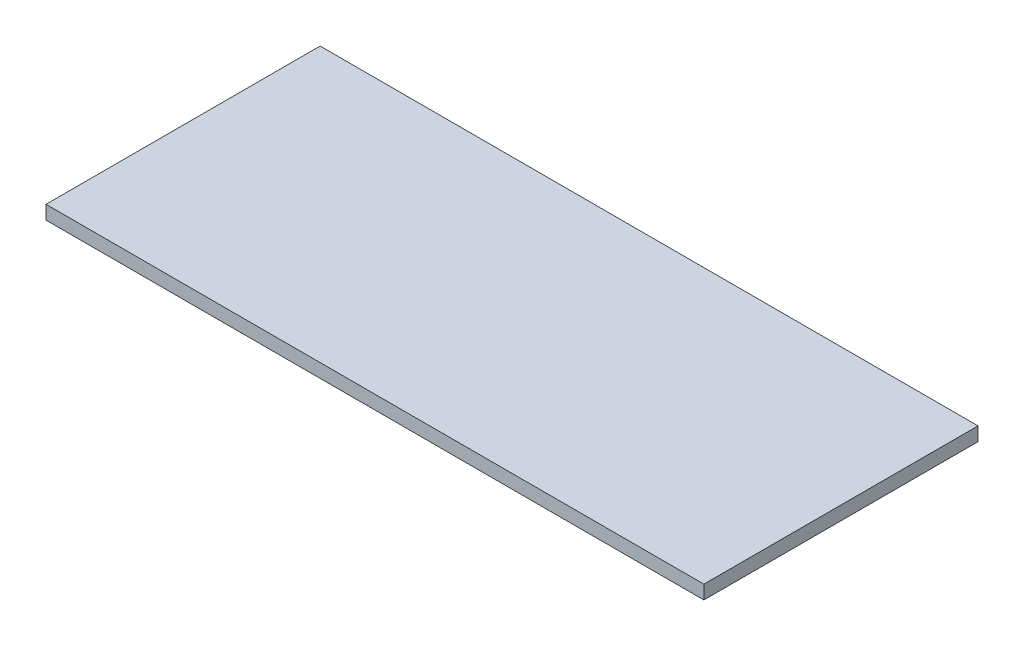
ISO-10303-21;
HEADER;
FILE_DESCRIPTION(('STEP AP214'),'2;1');
FILE_NAME('part.step','',(''),(''),'','','');
FILE_SCHEMA(('AUTOMOTIVE_DESIGN { 1 0 10303 214 1 1 1 1 }'));
ENDSEC;
DATA;
#1=APPLICATION_CONTEXT('core data for automotive mechanical design processes');
#2=APPLICATION_PROTOCOL_DEFINITION('international standard','automotive_design',2000,#1);
#3=PRODUCT_CONTEXT('',#1,'mechanical');
#4=PRODUCT('Part','Part','',(#3));
#5=PRODUCT_RELATED_PRODUCT_CATEGORY('part','',(#4));
#6=PRODUCT_DEFINITION_FORMATION('','',#4);
#7=PRODUCT_DEFINITION_CONTEXT('part definition',#1,'design');
#8=PRODUCT_DEFINITION('design','',#6,#7);
#9=PRODUCT_DEFINITION_SHAPE('','',#8);
#10=(LENGTH_UNIT() NAMED_UNIT(*) SI_UNIT(.MILLI.,.METRE.));
#11=(NAMED_UNIT(*) PLANE_ANGLE_UNIT() SI_UNIT($,.RADIAN.));
#12=(NAMED_UNIT(*) SI_UNIT($,.STERADIAN.) SOLID_ANGLE_UNIT());
#13=UNCERTAINTY_MEASURE_WITH_UNIT(LENGTH_MEASURE(1.E-05),#10,'distance_accuracy_value','');
#14=(GEOMETRIC_REPRESENTATION_CONTEXT(3) GLOBAL_UNCERTAINTY_ASSIGNED_CONTEXT((#13)) GLOBAL_UNIT_ASSIGNED_CONTEXT((#10,
#11,#12)) REPRESENTATION_CONTEXT('',''));
#15=CARTESIAN_POINT('',(0.,0.,0.));
#16=DIRECTION('',(0.,0.,1.));
#17=DIRECTION('',(1.,0.,0.));
#18=AXIS2_PLACEMENT_3D('',#15,#16,#17);
#19=CARTESIAN_POINT('',(-80.5584295750127,25.,-34.1358809801634));
#20=DIRECTION('',(1.,0.,0.));
#21=DIRECTION('',(0.,0.,-1.));
#22=AXIS2_PLACEMENT_3D('',#19,#20,#21);
#23=PLANE('',#22);
#24=DIRECTION('',(0.,0.,1.));
#25=VECTOR('',#24,1.);
#26=CARTESIAN_POINT('',(-80.5584295750127,0.,-34.1358809801634));
#27=LINE('',#26,#25);
#28=CARTESIAN_POINT('',(-80.5584295750127,0.,-34.1358809801634));
#29=VERTEX_POINT('',#28);
#30=CARTESIAN_POINT('',(-80.5584295750127,0.,465.864119019837));
#31=VERTEX_POINT('',#30);
#32=EDGE_CURVE('E96',#29,#31,#27,.T.);
#33=ORIENTED_EDGE('',*,*,#32,.T.);
#34=DIRECTION('',(0.,-1.,0.));
#35=VECTOR('',#34,1.);
#36=CARTESIAN_POINT('',(-80.5584295750127,25.,465.864119019837));
#37=LINE('',#36,#35);
#38=CARTESIAN_POINT('',(-80.5584295750127,25.,465.864119019837));
#39=VERTEX_POINT('',#38);
#40=EDGE_CURVE('E11',#39,#31,#37,.T.);
#41=ORIENTED_EDGE('',*,*,#40,.F.);
#42=DIRECTION('',(0.,0.,1.));
#43=VECTOR('',#42,1.);
#44=CARTESIAN_POINT('',(-80.5584295750127,25.,-34.1358809801634));
#45=LINE('',#44,#43);
#46=CARTESIAN_POINT('',(-80.5584295750127,25.,-34.1358809801634));
#47=VERTEX_POINT('',#46);
#48=EDGE_CURVE('E82',#47,#39,#45,.T.);
#49=ORIENTED_EDGE('',*,*,#48,.F.);
#50=DIRECTION('',(0.,-1.,0.));
#51=VECTOR('',#50,1.);
#52=CARTESIAN_POINT('',(-80.5584295750127,25.,-34.1358809801634));
#53=LINE('',#52,#51);
#54=EDGE_CURVE('E49',#47,#29,#53,.T.);
#55=ORIENTED_EDGE('',*,*,#54,.T.);
#56=EDGE_LOOP('',(#33,#41,#49,#55));
#57=FACE_BOUND('',#56,.T.);
#58=ADVANCED_FACE('F33',(#57),#23,.F.);
#59=CARTESIAN_POINT('',(-80.5584295750127,25.,465.864119019837));
#60=DIRECTION('',(0.,0.,-1.));
#61=DIRECTION('',(-1.,0.,0.));
#62=AXIS2_PLACEMENT_3D('',#59,#60,#61);
#63=PLANE('',#62);
#64=DIRECTION('',(1.,0.,0.));
#65=VECTOR('',#64,1.);
#66=CARTESIAN_POINT('',(-80.5584295750127,0.,465.864119019837));
#67=LINE('',#66,#65);
#68=CARTESIAN_POINT('',(1119.44157042499,0.,465.864119019837));
#69=VERTEX_POINT('',#68);
#70=EDGE_CURVE('E87',#31,#69,#67,.T.);
#71=ORIENTED_EDGE('',*,*,#70,.T.);
#72=DIRECTION('',(0.,-1.,0.));
#73=VECTOR('',#72,1.);
#74=CARTESIAN_POINT('',(1119.44157042499,25.,465.864119019837));
#75=LINE('',#74,#73);
#76=CARTESIAN_POINT('',(1119.44157042499,25.,465.864119019837));
#77=VERTEX_POINT('',#76);
#78=EDGE_CURVE('E41',#77,#69,#75,.T.);
#79=ORIENTED_EDGE('',*,*,#78,.F.);
#80=DIRECTION('',(1.,0.,0.));
#81=VECTOR('',#80,1.);
#82=CARTESIAN_POINT('',(-80.5584295750127,25.,465.864119019837));
#83=LINE('',#82,#81);
#84=EDGE_CURVE('E74',#39,#77,#83,.T.);
#85=ORIENTED_EDGE('',*,*,#84,.F.);
#86=ORIENTED_EDGE('',*,*,#40,.T.);
#87=EDGE_LOOP('',(#71,#79,#85,#86));
#88=FACE_BOUND('',#87,.T.);
#89=ADVANCED_FACE('F86',(#88),#63,.F.);
#90=CARTESIAN_POINT('',(1119.44157042499,25.,-34.1358809801634));
#91=DIRECTION('',(1.,0.,0.));
#92=DIRECTION('',(0.,0.,-1.));
#93=AXIS2_PLACEMENT_3D('',#90,#91,#92);
#94=PLANE('',#93);
#95=DIRECTION('',(0.,0.,1.));
#96=VECTOR('',#95,1.);
#97=CARTESIAN_POINT('',(1119.44157042499,0.,-34.1358809801634));
#98=LINE('',#97,#96);
#99=CARTESIAN_POINT('',(1119.44157042499,0.,-34.1358809801634));
#100=VERTEX_POINT('',#99);
#101=EDGE_CURVE('E99',#100,#69,#98,.T.);
#102=ORIENTED_EDGE('',*,*,#101,.F.);
#103=DIRECTION('',(0.,-1.,0.));
#104=VECTOR('',#103,1.);
#105=CARTESIAN_POINT('',(1119.44157042499,25.,-34.1358809801634));
#106=LINE('',#105,#104);
#107=CARTESIAN_POINT('',(1119.44157042499,25.,-34.1358809801634));
#108=VERTEX_POINT('',#107);
#109=EDGE_CURVE('E63',#108,#100,#106,.T.);
#110=ORIENTED_EDGE('',*,*,#109,.F.);
#111=DIRECTION('',(0.,0.,1.));
#112=VECTOR('',#111,1.);
#113=CARTESIAN_POINT('',(1119.44157042499,25.,-34.1358809801634));
#114=LINE('',#113,#112);
#115=EDGE_CURVE('E81',#108,#77,#114,.T.);
#116=ORIENTED_EDGE('',*,*,#115,.T.);
#117=ORIENTED_EDGE('',*,*,#78,.T.);
#118=EDGE_LOOP('',(#102,#110,#116,#117));
#119=FACE_BOUND('',#118,.T.);
#120=ADVANCED_FACE('F90',(#119),#94,.T.);
#121=CARTESIAN_POINT('',(-80.5584295750127,25.,-34.1358809801634));
#122=DIRECTION('',(0.,0.,-1.));
#123=DIRECTION('',(-1.,0.,0.));
#124=AXIS2_PLACEMENT_3D('',#121,#122,#123);
#125=PLANE('',#124);
#126=DIRECTION('',(1.,0.,0.));
#127=VECTOR('',#126,1.);
#128=CARTESIAN_POINT('',(-80.5584295750127,0.,-34.1358809801634));
#129=LINE('',#128,#127);
#130=EDGE_CURVE('E101',#29,#100,#129,.T.);
#131=ORIENTED_EDGE('',*,*,#130,.F.);
#132=ORIENTED_EDGE('',*,*,#54,.F.);
#133=DIRECTION('',(1.,0.,0.));
#134=VECTOR('',#133,1.);
#135=CARTESIAN_POINT('',(-80.5584295750127,25.,-34.1358809801634));
#136=LINE('',#135,#134);
#137=EDGE_CURVE('E91',#47,#108,#136,.T.);
#138=ORIENTED_EDGE('',*,*,#137,.T.);
#139=ORIENTED_EDGE('',*,*,#109,.T.);
#140=EDGE_LOOP('',(#131,#132,#138,#139));
#141=FACE_BOUND('',#140,.T.);
#142=ADVANCED_FACE('F107',(#141),#125,.T.);
#143=CARTESIAN_POINT('',(0.,25.,0.));
#144=DIRECTION('',(0.,1.,0.));
#145=DIRECTION('',(0.,0.,1.));
#146=AXIS2_PLACEMENT_3D('',#143,#144,#145);
#147=PLANE('',#146);
#148=ORIENTED_EDGE('',*,*,#48,.T.);
#149=ORIENTED_EDGE('',*,*,#84,.T.);
#150=ORIENTED_EDGE('',*,*,#115,.F.);
#151=ORIENTED_EDGE('',*,*,#137,.F.);
#152=EDGE_LOOP('',(#148,#149,#150,#151));
#153=FACE_BOUND('',#152,.T.);
#154=ADVANCED_FACE('F78',(#153),#147,.T.);
#155=CARTESIAN_POINT('',(0.,0.,0.));
#156=DIRECTION('',(0.,1.,0.));
#157=DIRECTION('',(0.,0.,1.));
#158=AXIS2_PLACEMENT_3D('',#155,#156,#157);
#159=PLANE('',#158);
#160=ORIENTED_EDGE('',*,*,#32,.F.);
#161=ORIENTED_EDGE('',*,*,#130,.T.);
#162=ORIENTED_EDGE('',*,*,#101,.T.);
#163=ORIENTED_EDGE('',*,*,#70,.F.);
#164=EDGE_LOOP('',(#160,#161,#162,#163));
#165=FACE_BOUND('',#164,.T.);
#166=ADVANCED_FACE('F106',(#165),#159,.F.);
#167=CLOSED_SHELL('',(#58,#89,#120,#142,#154,#166));
#168=MANIFOLD_SOLID_BREP('B2',#167);
#169=ADVANCED_BREP_SHAPE_REPRESENTATION('',(#18,#168),#14);
#170=SHAPE_DEFINITION_REPRESENTATION(#9,#169);
ENDSEC;
END-ISO-10303-21;
